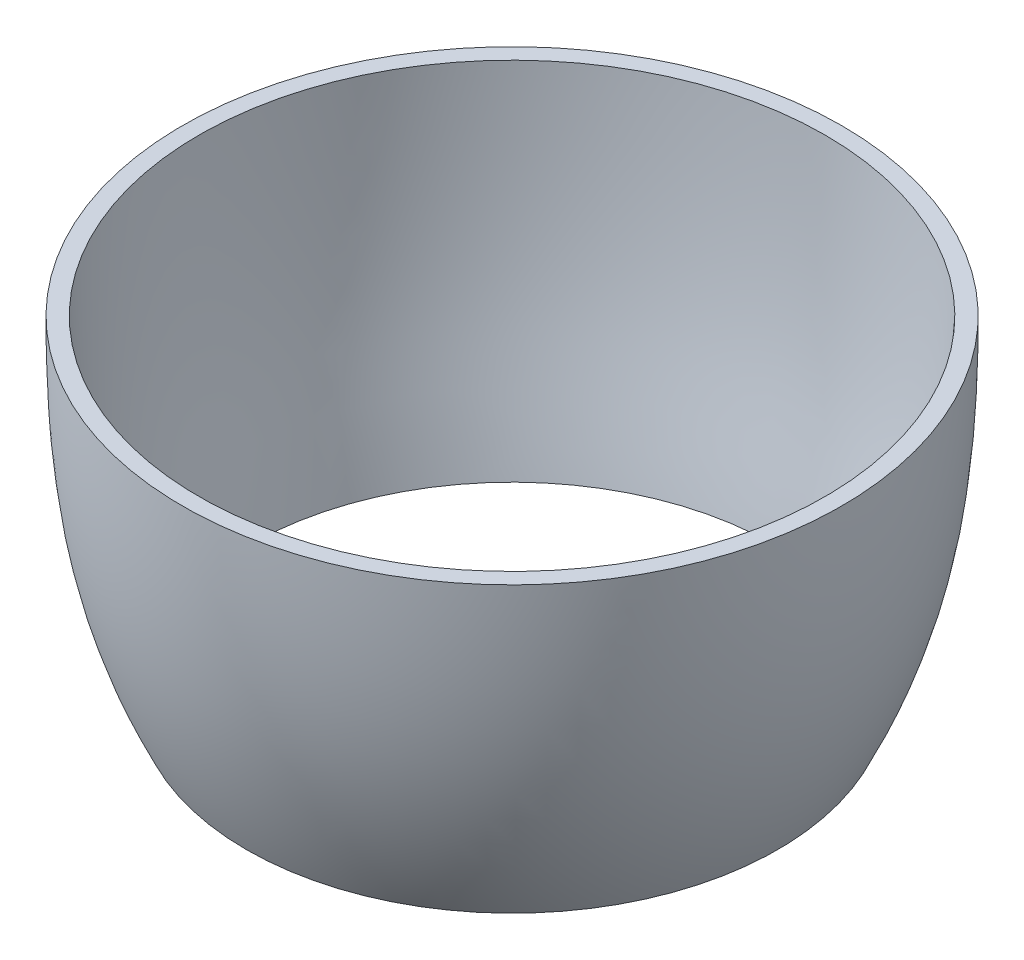
ISO-10303-21;
HEADER;
FILE_DESCRIPTION(('STEP AP214'),'2;1');
FILE_NAME('part.step','',(''),(''),'','','');
FILE_SCHEMA(('AUTOMOTIVE_DESIGN { 1 0 10303 214 1 1 1 1 }'));
ENDSEC;
DATA;
#1=APPLICATION_CONTEXT('core data for automotive mechanical design processes');
#2=APPLICATION_PROTOCOL_DEFINITION('international standard','automotive_design',2000,#1);
#3=PRODUCT_CONTEXT('',#1,'mechanical');
#4=PRODUCT('Part','Part','',(#3));
#5=PRODUCT_RELATED_PRODUCT_CATEGORY('part','',(#4));
#6=PRODUCT_DEFINITION_FORMATION('','',#4);
#7=PRODUCT_DEFINITION_CONTEXT('part definition',#1,'design');
#8=PRODUCT_DEFINITION('design','',#6,#7);
#9=PRODUCT_DEFINITION_SHAPE('','',#8);
#10=(LENGTH_UNIT() NAMED_UNIT(*) SI_UNIT(.MILLI.,.METRE.));
#11=(NAMED_UNIT(*) PLANE_ANGLE_UNIT() SI_UNIT($,.RADIAN.));
#12=(NAMED_UNIT(*) SI_UNIT($,.STERADIAN.) SOLID_ANGLE_UNIT());
#13=UNCERTAINTY_MEASURE_WITH_UNIT(LENGTH_MEASURE(1.E-05),#10,'distance_accuracy_value','');
#14=(GEOMETRIC_REPRESENTATION_CONTEXT(3) GLOBAL_UNCERTAINTY_ASSIGNED_CONTEXT((#13)) GLOBAL_UNIT_ASSIGNED_CONTEXT((#10,
#11,#12)) REPRESENTATION_CONTEXT('',''));
#15=CARTESIAN_POINT('',(0.,0.,0.));
#16=DIRECTION('',(0.,0.,1.));
#17=DIRECTION('',(1.,0.,0.));
#18=AXIS2_PLACEMENT_3D('',#15,#16,#17);
#19=CARTESIAN_POINT('',(0.,0.,-20.4718103514064));
#20=CARTESIAN_POINT('',(0.,3.3666569590375,-22.1136496489198));
#21=CARTESIAN_POINT('',(0.,11.6704637451509,-24.9825323692175));
#22=CARTESIAN_POINT('',(0.,20.461634145622,-25.4000142180566));
#23=CARTESIAN_POINT('',(0.,25.4,-25.4));
#24=B_SPLINE_CURVE_WITH_KNOTS('',3,(#19,#20,#21,#22,#23),.UNSPECIFIED.,.F.,.F.,(4,1,4),(0.,
0.430654702791089,1.),.UNSPECIFIED.);
#25=CARTESIAN_POINT('',(0.,0.,0.));
#26=DIRECTION('',(0.,-1.,0.));
#27=AXIS1_PLACEMENT('',#25,#26);
#28=SURFACE_OF_REVOLUTION('',#24,#27);
#29=CARTESIAN_POINT('',(0.,25.4,0.));
#30=DIRECTION('',(0.,-1.,0.));
#31=DIRECTION('',(0.,0.,-1.));
#32=AXIS2_PLACEMENT_3D('',#29,#30,#31);
#33=CIRCLE('',#32,25.4);
#34=CARTESIAN_POINT('',(0.,25.4,-25.4));
#35=VERTEX_POINT('',#34);
#36=EDGE_CURVE('E10',#35,#35,#33,.T.);
#37=ORIENTED_EDGE('',*,*,#36,.T.);
#38=EDGE_LOOP('',(#37));
#39=FACE_BOUND('',#38,.T.);
#40=CARTESIAN_POINT('',(0.,0.,0.));
#41=DIRECTION('',(0.,-1.,0.));
#42=DIRECTION('',(0.,0.,-1.));
#43=AXIS2_PLACEMENT_3D('',#40,#41,#42);
#44=CIRCLE('',#43,20.4718103514064);
#45=CARTESIAN_POINT('',(0.,0.,-20.4718103514064));
#46=VERTEX_POINT('',#45);
#47=EDGE_CURVE('E46',#46,#46,#44,.T.);
#48=ORIENTED_EDGE('',*,*,#47,.F.);
#49=EDGE_LOOP('',(#48));
#50=FACE_BOUND('',#49,.T.);
#51=ADVANCED_FACE('F31',(#39,#50),#28,.F.);
#52=CARTESIAN_POINT('',(0.,25.4,-25.4));
#53=DIRECTION('',(0.,1.,0.));
#54=DIRECTION('',(0.,0.,1.));
#55=AXIS2_PLACEMENT_3D('',#52,#53,#54);
#56=PLANE('',#55);
#57=CARTESIAN_POINT('',(0.,25.4,0.));
#58=DIRECTION('',(0.,-1.,0.));
#59=DIRECTION('',(0.,0.,-1.));
#60=AXIS2_PLACEMENT_3D('',#57,#58,#59);
#61=CIRCLE('',#60,24.13);
#62=CARTESIAN_POINT('',(0.,25.4,-24.13));
#63=VERTEX_POINT('',#62);
#64=EDGE_CURVE('E38',#63,#63,#61,.T.);
#65=ORIENTED_EDGE('',*,*,#64,.T.);
#66=EDGE_LOOP('',(#65));
#67=FACE_BOUND('',#66,.T.);
#68=ORIENTED_EDGE('',*,*,#36,.F.);
#69=EDGE_LOOP('',(#68));
#70=FACE_BOUND('',#69,.T.);
#71=ADVANCED_FACE('F65',(#67,#70),#56,.T.);
#72=CARTESIAN_POINT('',(0.,25.4,-24.13));
#73=CARTESIAN_POINT('',(0.,20.3624798746307,-23.841101975006));
#74=CARTESIAN_POINT('',(0.,11.7767660094664,-23.0731976484054));
#75=CARTESIAN_POINT('',(0.,3.45883722255565,-20.9042093886987));
#76=CARTESIAN_POINT('',(0.,0.,-20.2178103514064));
#77=B_SPLINE_CURVE_WITH_KNOTS('',3,(#72,#73,#74,#75,#76),.UNSPECIFIED.,.F.,.F.,(4,1,4),(0.,
0.588812346183869,1.),.UNSPECIFIED.);
#78=CARTESIAN_POINT('',(0.,0.,0.));
#79=DIRECTION('',(0.,-1.,0.));
#80=AXIS1_PLACEMENT('',#78,#79);
#81=SURFACE_OF_REVOLUTION('',#77,#80);
#82=CARTESIAN_POINT('',(0.,0.,0.));
#83=DIRECTION('',(0.,-1.,0.));
#84=DIRECTION('',(0.,0.,-1.));
#85=AXIS2_PLACEMENT_3D('',#82,#83,#84);
#86=CIRCLE('',#85,20.2178103514064);
#87=CARTESIAN_POINT('',(0.,0.,-20.2178103514064));
#88=VERTEX_POINT('',#87);
#89=EDGE_CURVE('E42',#88,#88,#86,.T.);
#90=ORIENTED_EDGE('',*,*,#89,.T.);
#91=EDGE_LOOP('',(#90));
#92=FACE_BOUND('',#91,.T.);
#93=ORIENTED_EDGE('',*,*,#64,.F.);
#94=EDGE_LOOP('',(#93));
#95=FACE_BOUND('',#94,.T.);
#96=ADVANCED_FACE('F61',(#92,#95),#81,.F.);
#97=CARTESIAN_POINT('',(0.,0.,-20.2178103514064));
#98=DIRECTION('',(0.,-1.,0.));
#99=DIRECTION('',(0.,0.,-1.));
#100=AXIS2_PLACEMENT_3D('',#97,#98,#99);
#101=PLANE('',#100);
#102=ORIENTED_EDGE('',*,*,#47,.T.);
#103=EDGE_LOOP('',(#102));
#104=FACE_BOUND('',#103,.T.);
#105=ORIENTED_EDGE('',*,*,#89,.F.);
#106=EDGE_LOOP('',(#105));
#107=FACE_BOUND('',#106,.T.);
#108=ADVANCED_FACE('F64',(#104,#107),#101,.T.);
#109=CLOSED_SHELL('',(#51,#71,#96,#108));
#110=MANIFOLD_SOLID_BREP('B2',#109);
#111=ADVANCED_BREP_SHAPE_REPRESENTATION('',(#18,#110),#14);
#112=SHAPE_DEFINITION_REPRESENTATION(#9,#111);
ENDSEC;
END-ISO-10303-21;
